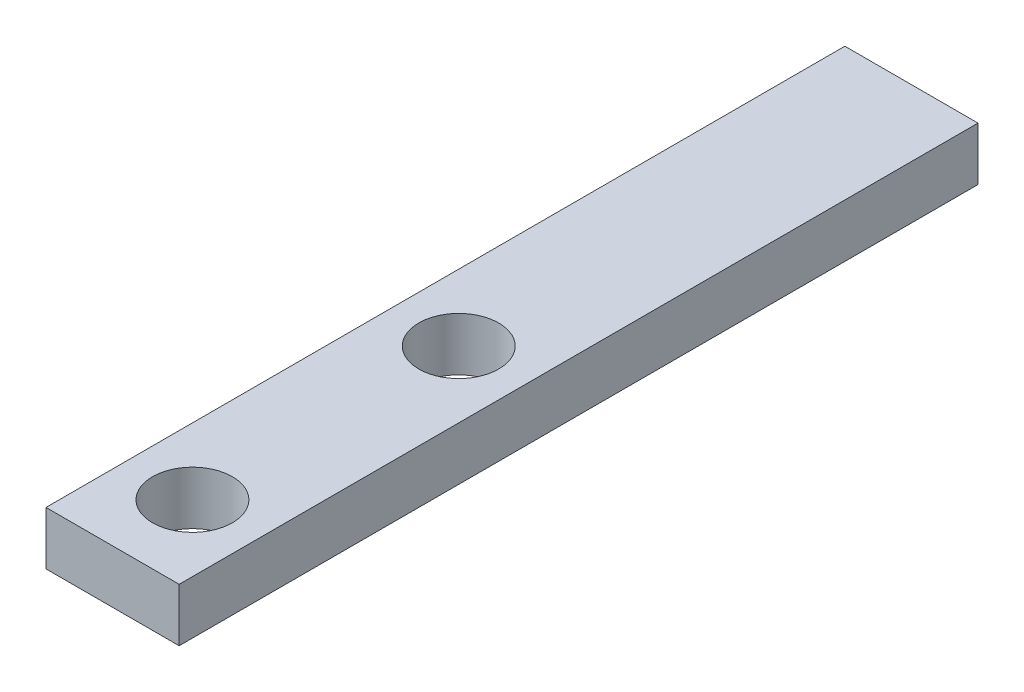
ISO-10303-21;
HEADER;
FILE_DESCRIPTION(('STEP AP214'),'2;1');
FILE_NAME('part.step','',(''),(''),'','','');
FILE_SCHEMA(('AUTOMOTIVE_DESIGN { 1 0 10303 214 1 1 1 1 }'));
ENDSEC;
DATA;
#1=APPLICATION_CONTEXT('core data for automotive mechanical design processes');
#2=APPLICATION_PROTOCOL_DEFINITION('international standard','automotive_design',2000,#1);
#3=PRODUCT_CONTEXT('',#1,'mechanical');
#4=PRODUCT('Part','Part','',(#3));
#5=PRODUCT_RELATED_PRODUCT_CATEGORY('part','',(#4));
#6=PRODUCT_DEFINITION_FORMATION('','',#4);
#7=PRODUCT_DEFINITION_CONTEXT('part definition',#1,'design');
#8=PRODUCT_DEFINITION('design','',#6,#7);
#9=PRODUCT_DEFINITION_SHAPE('','',#8);
#10=(LENGTH_UNIT() NAMED_UNIT(*) SI_UNIT(.MILLI.,.METRE.));
#11=(NAMED_UNIT(*) PLANE_ANGLE_UNIT() SI_UNIT($,.RADIAN.));
#12=(NAMED_UNIT(*) SI_UNIT($,.STERADIAN.) SOLID_ANGLE_UNIT());
#13=UNCERTAINTY_MEASURE_WITH_UNIT(LENGTH_MEASURE(1.E-05),#10,'distance_accuracy_value','');
#14=(GEOMETRIC_REPRESENTATION_CONTEXT(3) GLOBAL_UNCERTAINTY_ASSIGNED_CONTEXT((#13)) GLOBAL_UNIT_ASSIGNED_CONTEXT((#10,
#11,#12)) REPRESENTATION_CONTEXT('',''));
#15=CARTESIAN_POINT('',(0.,0.,0.));
#16=DIRECTION('',(0.,0.,1.));
#17=DIRECTION('',(1.,0.,0.));
#18=AXIS2_PLACEMENT_3D('',#15,#16,#17);
#19=CARTESIAN_POINT('',(0.,2.,0.));
#20=DIRECTION('',(0.,1.,0.));
#21=DIRECTION('',(0.,0.,1.));
#22=AXIS2_PLACEMENT_3D('',#19,#20,#21);
#23=PLANE('',#22);
#24=CARTESIAN_POINT('',(0.,2.,12.));
#25=DIRECTION('',(0.,1.,0.));
#26=DIRECTION('',(0.,0.,1.));
#27=AXIS2_PLACEMENT_3D('',#24,#25,#26);
#28=CIRCLE('',#27,1.5);
#29=CARTESIAN_POINT('',(0.,2.,13.5));
#30=VERTEX_POINT('',#29);
#31=EDGE_CURVE('E100',#30,#30,#28,.T.);
#32=ORIENTED_EDGE('',*,*,#31,.F.);
#33=EDGE_LOOP('',(#32));
#34=FACE_BOUND('',#33,.T.);
#35=DIRECTION('',(0.,0.,-1.));
#36=VECTOR('',#35,1.);
#37=CARTESIAN_POINT('',(2.5,2.,-15.));
#38=LINE('',#37,#36);
#39=CARTESIAN_POINT('',(2.5,2.,15.));
#40=VERTEX_POINT('',#39);
#41=CARTESIAN_POINT('',(2.5,2.,-15.));
#42=VERTEX_POINT('',#41);
#43=EDGE_CURVE('E85',#40,#42,#38,.T.);
#44=ORIENTED_EDGE('',*,*,#43,.T.);
#45=DIRECTION('',(-1.,0.,0.));
#46=VECTOR('',#45,1.);
#47=CARTESIAN_POINT('',(-2.5,2.,-15.));
#48=LINE('',#47,#46);
#49=CARTESIAN_POINT('',(-2.5,2.,-15.));
#50=VERTEX_POINT('',#49);
#51=EDGE_CURVE('E80',#42,#50,#48,.T.);
#52=ORIENTED_EDGE('',*,*,#51,.T.);
#53=DIRECTION('',(0.,0.,1.));
#54=VECTOR('',#53,1.);
#55=CARTESIAN_POINT('',(-2.5,2.,-15.));
#56=LINE('',#55,#54);
#57=CARTESIAN_POINT('',(-2.5,2.,15.));
#58=VERTEX_POINT('',#57);
#59=EDGE_CURVE('E83',#50,#58,#56,.T.);
#60=ORIENTED_EDGE('',*,*,#59,.T.);
#61=DIRECTION('',(1.,0.,0.));
#62=VECTOR('',#61,1.);
#63=CARTESIAN_POINT('',(-2.5,2.,15.));
#64=LINE('',#63,#62);
#65=EDGE_CURVE('E50',#58,#40,#64,.T.);
#66=ORIENTED_EDGE('',*,*,#65,.T.);
#67=EDGE_LOOP('',(#44,#52,#60,#66));
#68=FACE_BOUND('',#67,.T.);
#69=CARTESIAN_POINT('',(0.,2.,1.99999999999999));
#70=DIRECTION('',(0.,1.,0.));
#71=DIRECTION('',(0.,0.,1.));
#72=AXIS2_PLACEMENT_3D('',#69,#70,#71);
#73=CIRCLE('',#72,1.5);
#74=CARTESIAN_POINT('',(0.,2.,3.49999999999999));
#75=VERTEX_POINT('',#74);
#76=EDGE_CURVE('E115',#75,#75,#73,.T.);
#77=ORIENTED_EDGE('',*,*,#76,.F.);
#78=EDGE_LOOP('',(#77));
#79=FACE_BOUND('',#78,.T.);
#80=ADVANCED_FACE('F33',(#34,#68,#79),#23,.T.);
#81=CARTESIAN_POINT('',(0.,0.,0.));
#82=DIRECTION('',(0.,1.,0.));
#83=DIRECTION('',(0.,0.,1.));
#84=AXIS2_PLACEMENT_3D('',#81,#82,#83);
#85=PLANE('',#84);
#86=DIRECTION('',(0.,0.,-1.));
#87=VECTOR('',#86,1.);
#88=CARTESIAN_POINT('',(2.5,0.,-15.));
#89=LINE('',#88,#87);
#90=CARTESIAN_POINT('',(2.5,0.,15.));
#91=VERTEX_POINT('',#90);
#92=CARTESIAN_POINT('',(2.5,0.,-15.));
#93=VERTEX_POINT('',#92);
#94=EDGE_CURVE('E97',#91,#93,#89,.T.);
#95=ORIENTED_EDGE('',*,*,#94,.F.);
#96=DIRECTION('',(1.,0.,0.));
#97=VECTOR('',#96,1.);
#98=CARTESIAN_POINT('',(-2.5,0.,15.));
#99=LINE('',#98,#97);
#100=CARTESIAN_POINT('',(-2.5,0.,15.));
#101=VERTEX_POINT('',#100);
#102=EDGE_CURVE('E73',#101,#91,#99,.T.);
#103=ORIENTED_EDGE('',*,*,#102,.F.);
#104=DIRECTION('',(0.,0.,1.));
#105=VECTOR('',#104,1.);
#106=CARTESIAN_POINT('',(-2.5,0.,-15.));
#107=LINE('',#106,#105);
#108=CARTESIAN_POINT('',(-2.5,0.,-15.));
#109=VERTEX_POINT('',#108);
#110=EDGE_CURVE('E67',#109,#101,#107,.T.);
#111=ORIENTED_EDGE('',*,*,#110,.F.);
#112=DIRECTION('',(-1.,0.,0.));
#113=VECTOR('',#112,1.);
#114=CARTESIAN_POINT('',(-2.5,0.,-15.));
#115=LINE('',#114,#113);
#116=EDGE_CURVE('E89',#93,#109,#115,.T.);
#117=ORIENTED_EDGE('',*,*,#116,.F.);
#118=EDGE_LOOP('',(#95,#103,#111,#117));
#119=FACE_BOUND('',#118,.T.);
#120=CARTESIAN_POINT('',(0.,0.,12.));
#121=DIRECTION('',(0.,1.,0.));
#122=DIRECTION('',(0.,0.,1.));
#123=AXIS2_PLACEMENT_3D('',#120,#121,#122);
#124=CIRCLE('',#123,1.5);
#125=CARTESIAN_POINT('',(0.,0.,13.5));
#126=VERTEX_POINT('',#125);
#127=EDGE_CURVE('E112',#126,#126,#124,.T.);
#128=ORIENTED_EDGE('',*,*,#127,.T.);
#129=EDGE_LOOP('',(#128));
#130=FACE_BOUND('',#129,.T.);
#131=CARTESIAN_POINT('',(0.,0.,1.99999999999999));
#132=DIRECTION('',(0.,1.,0.));
#133=DIRECTION('',(0.,0.,1.));
#134=AXIS2_PLACEMENT_3D('',#131,#132,#133);
#135=CIRCLE('',#134,1.5);
#136=CARTESIAN_POINT('',(0.,0.,3.49999999999999));
#137=VERTEX_POINT('',#136);
#138=EDGE_CURVE('E118',#137,#137,#135,.T.);
#139=ORIENTED_EDGE('',*,*,#138,.T.);
#140=EDGE_LOOP('',(#139));
#141=FACE_BOUND('',#140,.T.);
#142=ADVANCED_FACE('F108',(#119,#130,#141),#85,.F.);
#143=CARTESIAN_POINT('',(2.5,2.,-15.));
#144=DIRECTION('',(-1.,0.,0.));
#145=DIRECTION('',(0.,0.,1.));
#146=AXIS2_PLACEMENT_3D('',#143,#144,#145);
#147=PLANE('',#146);
#148=ORIENTED_EDGE('',*,*,#94,.T.);
#149=DIRECTION('',(0.,-1.,0.));
#150=VECTOR('',#149,1.);
#151=CARTESIAN_POINT('',(2.5,2.,-15.));
#152=LINE('',#151,#150);
#153=EDGE_CURVE('E11',#42,#93,#152,.T.);
#154=ORIENTED_EDGE('',*,*,#153,.F.);
#155=ORIENTED_EDGE('',*,*,#43,.F.);
#156=DIRECTION('',(0.,-1.,0.));
#157=VECTOR('',#156,1.);
#158=CARTESIAN_POINT('',(2.5,2.,15.));
#159=LINE('',#158,#157);
#160=EDGE_CURVE('E93',#40,#91,#159,.T.);
#161=ORIENTED_EDGE('',*,*,#160,.T.);
#162=EDGE_LOOP('',(#148,#154,#155,#161));
#163=FACE_BOUND('',#162,.T.);
#164=ADVANCED_FACE('F35',(#163),#147,.F.);
#165=CARTESIAN_POINT('',(-2.5,2.,-15.));
#166=DIRECTION('',(0.,0.,1.));
#167=DIRECTION('',(1.,0.,0.));
#168=AXIS2_PLACEMENT_3D('',#165,#166,#167);
#169=PLANE('',#168);
#170=ORIENTED_EDGE('',*,*,#116,.T.);
#171=DIRECTION('',(0.,-1.,0.));
#172=VECTOR('',#171,1.);
#173=CARTESIAN_POINT('',(-2.5,2.,-15.));
#174=LINE('',#173,#172);
#175=EDGE_CURVE('E42',#50,#109,#174,.T.);
#176=ORIENTED_EDGE('',*,*,#175,.F.);
#177=ORIENTED_EDGE('',*,*,#51,.F.);
#178=ORIENTED_EDGE('',*,*,#153,.T.);
#179=EDGE_LOOP('',(#170,#176,#177,#178));
#180=FACE_BOUND('',#179,.T.);
#181=ADVANCED_FACE('F88',(#180),#169,.F.);
#182=CARTESIAN_POINT('',(-2.5,2.,-15.));
#183=DIRECTION('',(1.,0.,0.));
#184=DIRECTION('',(0.,0.,-1.));
#185=AXIS2_PLACEMENT_3D('',#182,#183,#184);
#186=PLANE('',#185);
#187=ORIENTED_EDGE('',*,*,#110,.T.);
#188=DIRECTION('',(0.,-1.,0.));
#189=VECTOR('',#188,1.);
#190=CARTESIAN_POINT('',(-2.5,2.,15.));
#191=LINE('',#190,#189);
#192=EDGE_CURVE('E90',#58,#101,#191,.T.);
#193=ORIENTED_EDGE('',*,*,#192,.F.);
#194=ORIENTED_EDGE('',*,*,#59,.F.);
#195=ORIENTED_EDGE('',*,*,#175,.T.);
#196=EDGE_LOOP('',(#187,#193,#194,#195));
#197=FACE_BOUND('',#196,.T.);
#198=ADVANCED_FACE('F91',(#197),#186,.F.);
#199=CARTESIAN_POINT('',(-2.5,2.,15.));
#200=DIRECTION('',(0.,0.,-1.));
#201=DIRECTION('',(-1.,0.,0.));
#202=AXIS2_PLACEMENT_3D('',#199,#200,#201);
#203=PLANE('',#202);
#204=ORIENTED_EDGE('',*,*,#102,.T.);
#205=ORIENTED_EDGE('',*,*,#160,.F.);
#206=ORIENTED_EDGE('',*,*,#65,.F.);
#207=ORIENTED_EDGE('',*,*,#192,.T.);
#208=EDGE_LOOP('',(#204,#205,#206,#207));
#209=FACE_BOUND('',#208,.T.);
#210=ADVANCED_FACE('F105',(#209),#203,.F.);
#211=CARTESIAN_POINT('',(0.,2.,12.));
#212=DIRECTION('',(0.,-1.,0.));
#213=DIRECTION('',(0.,0.,-1.));
#214=AXIS2_PLACEMENT_3D('',#211,#212,#213);
#215=CYLINDRICAL_SURFACE('',#214,1.5);
#216=ORIENTED_EDGE('',*,*,#31,.T.);
#217=EDGE_LOOP('',(#216));
#218=FACE_BOUND('',#217,.T.);
#219=ORIENTED_EDGE('',*,*,#127,.F.);
#220=EDGE_LOOP('',(#219));
#221=FACE_BOUND('',#220,.T.);
#222=ADVANCED_FACE('F135',(#218,#221),#215,.F.);
#223=CARTESIAN_POINT('',(0.,2.,1.99999999999999));
#224=DIRECTION('',(0.,-1.,0.));
#225=DIRECTION('',(0.,0.,-1.));
#226=AXIS2_PLACEMENT_3D('',#223,#224,#225);
#227=CYLINDRICAL_SURFACE('',#226,1.5);
#228=ORIENTED_EDGE('',*,*,#76,.T.);
#229=EDGE_LOOP('',(#228));
#230=FACE_BOUND('',#229,.T.);
#231=ORIENTED_EDGE('',*,*,#138,.F.);
#232=EDGE_LOOP('',(#231));
#233=FACE_BOUND('',#232,.T.);
#234=ADVANCED_FACE('F124',(#230,#233),#227,.F.);
#235=CLOSED_SHELL('',(#80,#142,#164,#181,#198,#210,#222,#234));
#236=MANIFOLD_SOLID_BREP('B2',#235);
#237=ADVANCED_BREP_SHAPE_REPRESENTATION('',(#18,#236),#14);
#238=SHAPE_DEFINITION_REPRESENTATION(#9,#237);
ENDSEC;
END-ISO-10303-21;
